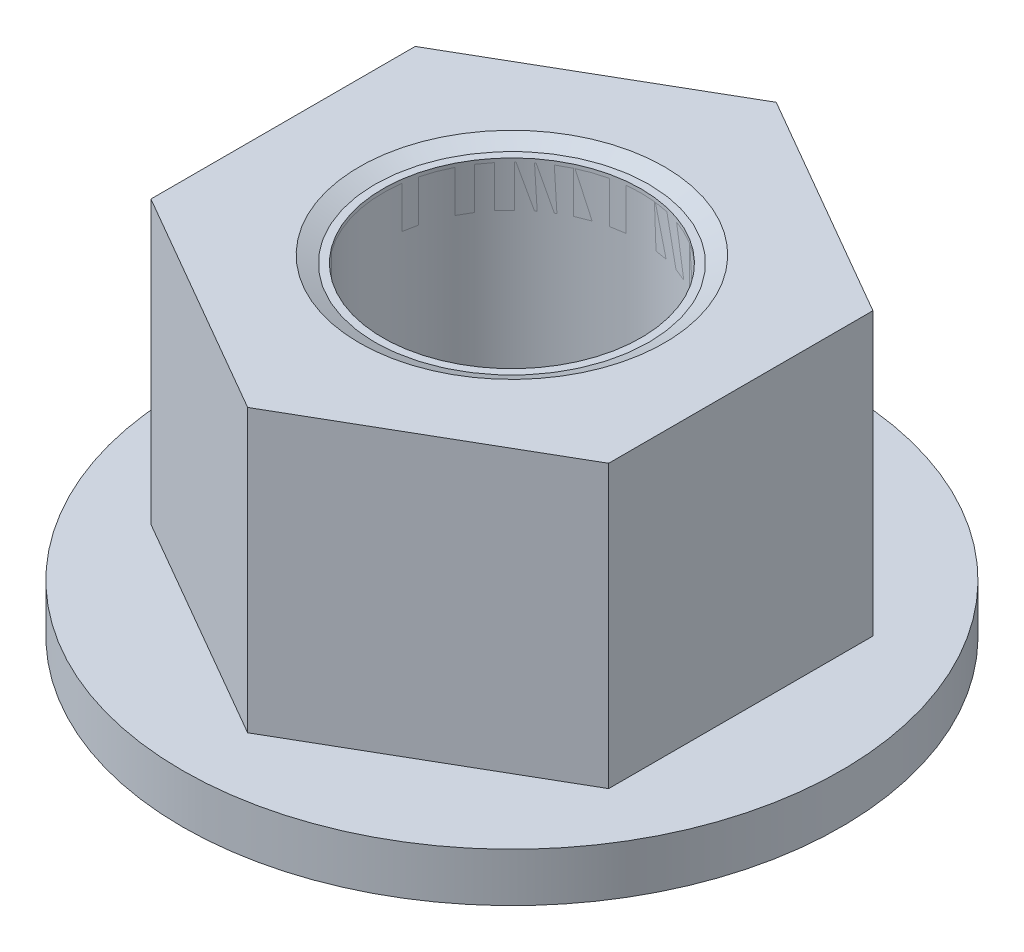
ISO-10303-21;
HEADER;
FILE_DESCRIPTION(('STEP AP214'),'2;1');
FILE_NAME('part.step','',(''),(''),'','','');
FILE_SCHEMA(('AUTOMOTIVE_DESIGN { 1 0 10303 214 1 1 1 1 }'));
ENDSEC;
DATA;
#1=APPLICATION_CONTEXT('core data for automotive mechanical design processes');
#2=APPLICATION_PROTOCOL_DEFINITION('international standard','automotive_design',2000,#1);
#3=PRODUCT_CONTEXT('',#1,'mechanical');
#4=PRODUCT('Part','Part','',(#3));
#5=PRODUCT_RELATED_PRODUCT_CATEGORY('part','',(#4));
#6=PRODUCT_DEFINITION_FORMATION('','',#4);
#7=PRODUCT_DEFINITION_CONTEXT('part definition',#1,'design');
#8=PRODUCT_DEFINITION('design','',#6,#7);
#9=PRODUCT_DEFINITION_SHAPE('','',#8);
#10=(LENGTH_UNIT() NAMED_UNIT(*) SI_UNIT(.MILLI.,.METRE.));
#11=(NAMED_UNIT(*) PLANE_ANGLE_UNIT() SI_UNIT($,.RADIAN.));
#12=(NAMED_UNIT(*) SI_UNIT($,.STERADIAN.) SOLID_ANGLE_UNIT());
#13=UNCERTAINTY_MEASURE_WITH_UNIT(LENGTH_MEASURE(1.E-05),#10,'distance_accuracy_value','');
#14=(GEOMETRIC_REPRESENTATION_CONTEXT(3) GLOBAL_UNCERTAINTY_ASSIGNED_CONTEXT((#13)) GLOBAL_UNIT_ASSIGNED_CONTEXT((#10,
#11,#12)) REPRESENTATION_CONTEXT('',''));
#15=CARTESIAN_POINT('',(0.,0.,0.));
#16=DIRECTION('',(0.,0.,1.));
#17=DIRECTION('',(1.,0.,0.));
#18=AXIS2_PLACEMENT_3D('',#15,#16,#17);
#19=CARTESIAN_POINT('',(0.,8.67515833333333,0.));
#20=DIRECTION('',(0.,-1.,0.));
#21=DIRECTION('',(0.,0.,-1.));
#22=AXIS2_PLACEMENT_3D('',#19,#20,#21);
#23=CYLINDRICAL_SURFACE('',#22,4.0291118051323);
#24=CARTESIAN_POINT('',(0.,8.67515833333333,0.));
#25=DIRECTION('',(0.,-1.,0.));
#26=DIRECTION('',(0.,0.,-1.));
#27=AXIS2_PLACEMENT_3D('',#24,#25,#26);
#28=CIRCLE('',#27,4.0291118051323);
#29=CARTESIAN_POINT('',(0.,8.67515833333333,-4.0291118051323));
#30=VERTEX_POINT('',#29);
#31=EDGE_CURVE('E11',#30,#30,#28,.T.);
#32=ORIENTED_EDGE('',*,*,#31,.T.);
#33=EDGE_LOOP('',(#32));
#34=FACE_BOUND('',#33,.T.);
#35=CARTESIAN_POINT('',(0.,10.09015,0.));
#36=DIRECTION('',(0.,-1.,0.));
#37=DIRECTION('',(0.,0.,-1.));
#38=AXIS2_PLACEMENT_3D('',#35,#36,#37);
#39=CIRCLE('',#38,4.0291118051323);
#40=CARTESIAN_POINT('',(0.,10.09015,-4.0291118051323));
#41=VERTEX_POINT('',#40);
#42=EDGE_CURVE('E61',#41,#41,#39,.T.);
#43=ORIENTED_EDGE('',*,*,#42,.F.);
#44=EDGE_LOOP('',(#43));
#45=FACE_BOUND('',#44,.T.);
#46=ADVANCED_FACE('F47',(#34,#45),#23,.F.);
#47=CARTESIAN_POINT('',(0.,8.67515833333333,-4.0291118051323));
#48=DIRECTION('',(0.,-1.,0.));
#49=DIRECTION('',(0.,0.,-1.));
#50=AXIS2_PLACEMENT_3D('',#47,#48,#49);
#51=PLANE('',#50);
#52=CARTESIAN_POINT('',(0.,8.67515833333333,0.));
#53=DIRECTION('',(0.,-1.,0.));
#54=DIRECTION('',(0.,0.,-1.));
#55=AXIS2_PLACEMENT_3D('',#52,#53,#54);
#56=CIRCLE('',#55,6.91320181468086);
#57=CARTESIAN_POINT('',(0.,8.67515833333333,-6.91320181468086));
#58=VERTEX_POINT('',#57);
#59=EDGE_CURVE('E53',#58,#58,#56,.T.);
#60=ORIENTED_EDGE('',*,*,#59,.T.);
#61=EDGE_LOOP('',(#60));
#62=FACE_BOUND('',#61,.T.);
#63=ORIENTED_EDGE('',*,*,#31,.F.);
#64=EDGE_LOOP('',(#63));
#65=FACE_BOUND('',#64,.T.);
#66=ADVANCED_FACE('F71',(#62,#65),#51,.T.);
#67=CARTESIAN_POINT('',(0.,8.59895833333333,0.));
#68=DIRECTION('',(0.,-1.,0.));
#69=DIRECTION('',(0.,0.,-1.));
#70=AXIS2_PLACEMENT_3D('',#67,#68,#69);
#71=TOROIDAL_SURFACE('',#70,5.42395833333333,1.49119166666667);
#72=CARTESIAN_POINT('',(0.,10.09015,0.));
#73=DIRECTION('',(0.,-1.,0.));
#74=DIRECTION('',(0.,0.,-1.));
#75=AXIS2_PLACEMENT_3D('',#72,#73,#74);
#76=CIRCLE('',#75,5.42395833333333);
#77=CARTESIAN_POINT('',(0.,10.09015,-5.42395833333333));
#78=VERTEX_POINT('',#77);
#79=EDGE_CURVE('E57',#78,#78,#76,.T.);
#80=ORIENTED_EDGE('',*,*,#79,.T.);
#81=EDGE_LOOP('',(#80));
#82=FACE_BOUND('',#81,.T.);
#83=ORIENTED_EDGE('',*,*,#59,.F.);
#84=EDGE_LOOP('',(#83));
#85=FACE_BOUND('',#84,.T.);
#86=ADVANCED_FACE('F75',(#82,#85),#71,.T.);
#87=CARTESIAN_POINT('',(0.,10.09015,-5.42395833333333));
#88=DIRECTION('',(0.,1.,0.));
#89=DIRECTION('',(0.,0.,1.));
#90=AXIS2_PLACEMENT_3D('',#87,#88,#89);
#91=PLANE('',#90);
#92=ORIENTED_EDGE('',*,*,#42,.T.);
#93=EDGE_LOOP('',(#92));
#94=FACE_BOUND('',#93,.T.);
#95=ORIENTED_EDGE('',*,*,#79,.F.);
#96=EDGE_LOOP('',(#95));
#97=FACE_BOUND('',#96,.T.);
#98=ADVANCED_FACE('F67',(#94,#97),#91,.T.);
#99=CLOSED_SHELL('',(#46,#66,#86,#98));
#100=MANIFOLD_SOLID_BREP('B2',#99);
#101=CARTESIAN_POINT('',(7.14375,10.31875,-4.12444598552339));
#102=DIRECTION('',(-0.5,0.,0.866025403784439));
#103=DIRECTION('',(0.866025403784439,0.,0.5));
#104=AXIS2_PLACEMENT_3D('',#101,#102,#103);
#105=PLANE('',#104);
#106=DIRECTION('',(0.866025403784439,0.,0.5));
#107=VECTOR('',#106,1.);
#108=CARTESIAN_POINT('',(7.14375,1.524,-4.12444598552339));
#109=LINE('',#108,#107);
#110=CARTESIAN_POINT('',(0.,1.524,-8.24889197104678));
#111=VERTEX_POINT('',#110);
#112=CARTESIAN_POINT('',(7.14375,1.524,-4.12444598552339));
#113=VERTEX_POINT('',#112);
#114=EDGE_CURVE('E124',#111,#113,#109,.T.);
#115=ORIENTED_EDGE('',*,*,#114,.F.);
#116=DIRECTION('',(0.,-1.,0.));
#117=VECTOR('',#116,1.);
#118=CARTESIAN_POINT('',(0.,10.31875,-8.24889197104678));
#119=LINE('',#118,#117);
#120=CARTESIAN_POINT('',(0.,10.31875,-8.24889197104678));
#121=VERTEX_POINT('',#120);
#122=EDGE_CURVE('E117',#121,#111,#119,.T.);
#123=ORIENTED_EDGE('',*,*,#122,.F.);
#124=DIRECTION('',(-0.866025403784439,0.,-0.5));
#125=VECTOR('',#124,1.);
#126=CARTESIAN_POINT('',(7.14375,10.31875,-4.12444598552339));
#127=LINE('',#126,#125);
#128=CARTESIAN_POINT('',(7.14375,10.31875,-4.12444598552339));
#129=VERTEX_POINT('',#128);
#130=EDGE_CURVE('E190',#129,#121,#127,.T.);
#131=ORIENTED_EDGE('',*,*,#130,.F.);
#132=DIRECTION('',(0.,-1.,0.));
#133=VECTOR('',#132,1.);
#134=CARTESIAN_POINT('',(7.14375,10.31875,-4.12444598552339));
#135=LINE('',#134,#133);
#136=EDGE_CURVE('E174',#129,#113,#135,.T.);
#137=ORIENTED_EDGE('',*,*,#136,.T.);
#138=EDGE_LOOP('',(#115,#123,#131,#137));
#139=FACE_BOUND('',#138,.T.);
#140=ADVANCED_FACE('F109',(#139),#105,.F.);
#141=CARTESIAN_POINT('',(0.,10.31875,-8.24889197104678));
#142=DIRECTION('',(0.5,0.,0.866025403784439));
#143=DIRECTION('',(0.866025403784439,0.,-0.5));
#144=AXIS2_PLACEMENT_3D('',#141,#142,#143);
#145=PLANE('',#144);
#146=DIRECTION('',(0.866025403784439,0.,-0.5));
#147=VECTOR('',#146,1.);
#148=CARTESIAN_POINT('',(0.,1.524,-8.24889197104678));
#149=LINE('',#148,#147);
#150=CARTESIAN_POINT('',(-7.14375,1.524,-4.12444598552339));
#151=VERTEX_POINT('',#150);
#152=EDGE_CURVE('E131',#151,#111,#149,.T.);
#153=ORIENTED_EDGE('',*,*,#152,.F.);
#154=DIRECTION('',(0.,-1.,0.));
#155=VECTOR('',#154,1.);
#156=CARTESIAN_POINT('',(-7.14375,10.31875,-4.12444598552339));
#157=LINE('',#156,#155);
#158=CARTESIAN_POINT('',(-7.14375,10.31875,-4.12444598552339));
#159=VERTEX_POINT('',#158);
#160=EDGE_CURVE('E222',#159,#151,#157,.T.);
#161=ORIENTED_EDGE('',*,*,#160,.F.);
#162=DIRECTION('',(-0.866025403784439,0.,0.5));
#163=VECTOR('',#162,1.);
#164=CARTESIAN_POINT('',(0.,10.31875,-8.24889197104678));
#165=LINE('',#164,#163);
#166=EDGE_CURVE('E195',#121,#159,#165,.T.);
#167=ORIENTED_EDGE('',*,*,#166,.F.);
#168=ORIENTED_EDGE('',*,*,#122,.T.);
#169=EDGE_LOOP('',(#153,#161,#167,#168));
#170=FACE_BOUND('',#169,.T.);
#171=ADVANCED_FACE('F225',(#170),#145,.F.);
#172=CARTESIAN_POINT('',(-7.14375,10.31875,-4.12444598552339));
#173=DIRECTION('',(1.,0.,0.));
#174=DIRECTION('',(0.,0.,-1.));
#175=AXIS2_PLACEMENT_3D('',#172,#173,#174);
#176=PLANE('',#175);
#177=DIRECTION('',(0.,0.,-1.));
#178=VECTOR('',#177,1.);
#179=CARTESIAN_POINT('',(-7.14375,1.524,-4.12444598552339));
#180=LINE('',#179,#178);
#181=CARTESIAN_POINT('',(-7.14375,1.524,4.12444598552339));
#182=VERTEX_POINT('',#181);
#183=EDGE_CURVE('E197',#182,#151,#180,.T.);
#184=ORIENTED_EDGE('',*,*,#183,.F.);
#185=DIRECTION('',(0.,-1.,0.));
#186=VECTOR('',#185,1.);
#187=CARTESIAN_POINT('',(-7.14375,10.31875,4.12444598552339));
#188=LINE('',#187,#186);
#189=CARTESIAN_POINT('',(-7.14375,10.31875,4.12444598552339));
#190=VERTEX_POINT('',#189);
#191=EDGE_CURVE('E218',#190,#182,#188,.T.);
#192=ORIENTED_EDGE('',*,*,#191,.F.);
#193=DIRECTION('',(0.,0.,1.));
#194=VECTOR('',#193,1.);
#195=CARTESIAN_POINT('',(-7.14375,10.31875,-4.12444598552339));
#196=LINE('',#195,#194);
#197=EDGE_CURVE('E203',#159,#190,#196,.T.);
#198=ORIENTED_EDGE('',*,*,#197,.F.);
#199=ORIENTED_EDGE('',*,*,#160,.T.);
#200=EDGE_LOOP('',(#184,#192,#198,#199));
#201=FACE_BOUND('',#200,.T.);
#202=ADVANCED_FACE('F286',(#201),#176,.F.);
#203=CARTESIAN_POINT('',(-7.14375,10.31875,4.12444598552339));
#204=DIRECTION('',(0.5,0.,-0.866025403784438));
#205=DIRECTION('',(-0.866025403784439,0.,-0.5));
#206=AXIS2_PLACEMENT_3D('',#203,#204,#205);
#207=PLANE('',#206);
#208=DIRECTION('',(-0.866025403784439,0.,-0.5));
#209=VECTOR('',#208,1.);
#210=CARTESIAN_POINT('',(-7.14375,1.524,4.12444598552339));
#211=LINE('',#210,#209);
#212=CARTESIAN_POINT('',(0.,1.524,8.24889197104678));
#213=VERTEX_POINT('',#212);
#214=EDGE_CURVE('E184',#213,#182,#211,.T.);
#215=ORIENTED_EDGE('',*,*,#214,.F.);
#216=DIRECTION('',(0.,-1.,0.));
#217=VECTOR('',#216,1.);
#218=CARTESIAN_POINT('',(0.,10.31875,8.24889197104678));
#219=LINE('',#218,#217);
#220=CARTESIAN_POINT('',(0.,10.31875,8.24889197104678));
#221=VERTEX_POINT('',#220);
#222=EDGE_CURVE('E173',#221,#213,#219,.T.);
#223=ORIENTED_EDGE('',*,*,#222,.F.);
#224=DIRECTION('',(0.866025403784439,0.,0.5));
#225=VECTOR('',#224,1.);
#226=CARTESIAN_POINT('',(-7.14375,10.31875,4.12444598552339));
#227=LINE('',#226,#225);
#228=EDGE_CURVE('E206',#190,#221,#227,.T.);
#229=ORIENTED_EDGE('',*,*,#228,.F.);
#230=ORIENTED_EDGE('',*,*,#191,.T.);
#231=EDGE_LOOP('',(#215,#223,#229,#230));
#232=FACE_BOUND('',#231,.T.);
#233=ADVANCED_FACE('F233',(#232),#207,.F.);
#234=CARTESIAN_POINT('',(0.,10.31875,8.24889197104678));
#235=DIRECTION('',(-0.5,0.,-0.866025403784439));
#236=DIRECTION('',(-0.866025403784439,0.,0.5));
#237=AXIS2_PLACEMENT_3D('',#234,#235,#236);
#238=PLANE('',#237);
#239=DIRECTION('',(-0.866025403784439,0.,0.5));
#240=VECTOR('',#239,1.);
#241=CARTESIAN_POINT('',(0.,1.524,8.24889197104678));
#242=LINE('',#241,#240);
#243=CARTESIAN_POINT('',(7.14375,1.524,4.12444598552339));
#244=VERTEX_POINT('',#243);
#245=EDGE_CURVE('E178',#244,#213,#242,.T.);
#246=ORIENTED_EDGE('',*,*,#245,.F.);
#247=DIRECTION('',(0.,-1.,0.));
#248=VECTOR('',#247,1.);
#249=CARTESIAN_POINT('',(7.14375,10.31875,4.12444598552339));
#250=LINE('',#249,#248);
#251=CARTESIAN_POINT('',(7.14375,10.31875,4.12444598552339));
#252=VERTEX_POINT('',#251);
#253=EDGE_CURVE('E165',#252,#244,#250,.T.);
#254=ORIENTED_EDGE('',*,*,#253,.F.);
#255=DIRECTION('',(0.866025403784439,0.,-0.5));
#256=VECTOR('',#255,1.);
#257=CARTESIAN_POINT('',(0.,10.31875,8.24889197104678));
#258=LINE('',#257,#256);
#259=EDGE_CURVE('E209',#221,#252,#258,.T.);
#260=ORIENTED_EDGE('',*,*,#259,.F.);
#261=ORIENTED_EDGE('',*,*,#222,.T.);
#262=EDGE_LOOP('',(#246,#254,#260,#261));
#263=FACE_BOUND('',#262,.T.);
#264=ADVANCED_FACE('F179',(#263),#238,.F.);
#265=CARTESIAN_POINT('',(7.14375,10.31875,4.12444598552339));
#266=DIRECTION('',(-1.,0.,0.));
#267=DIRECTION('',(0.,0.,1.));
#268=AXIS2_PLACEMENT_3D('',#265,#266,#267);
#269=PLANE('',#268);
#270=DIRECTION('',(0.,0.,1.));
#271=VECTOR('',#270,1.);
#272=CARTESIAN_POINT('',(7.14375,1.524,4.12444598552339));
#273=LINE('',#272,#271);
#274=EDGE_CURVE('E45',#113,#244,#273,.T.);
#275=ORIENTED_EDGE('',*,*,#274,.F.);
#276=ORIENTED_EDGE('',*,*,#136,.F.);
#277=DIRECTION('',(0.,0.,-1.));
#278=VECTOR('',#277,1.);
#279=CARTESIAN_POINT('',(7.14375,10.31875,4.12444598552339));
#280=LINE('',#279,#278);
#281=EDGE_CURVE('E169',#252,#129,#280,.T.);
#282=ORIENTED_EDGE('',*,*,#281,.F.);
#283=ORIENTED_EDGE('',*,*,#253,.T.);
#284=EDGE_LOOP('',(#275,#276,#282,#283));
#285=FACE_BOUND('',#284,.T.);
#286=ADVANCED_FACE('F167',(#285),#269,.F.);
#287=CARTESIAN_POINT('',(7.14375,10.31875,-4.12444598552339));
#288=DIRECTION('',(0.,-1.,0.));
#289=DIRECTION('',(0.,0.,-1.));
#290=AXIS2_PLACEMENT_3D('',#287,#288,#289);
#291=PLANE('',#290);
#292=CARTESIAN_POINT('',(0.,10.31875,0.));
#293=DIRECTION('',(0.,-1.,0.));
#294=DIRECTION('',(0.,0.,-1.));
#295=AXIS2_PLACEMENT_3D('',#292,#293,#294);
#296=CIRCLE('',#295,4.7625);
#297=CARTESIAN_POINT('',(0.,10.31875,-4.7625));
#298=VERTEX_POINT('',#297);
#299=EDGE_CURVE('E245',#298,#298,#296,.T.);
#300=ORIENTED_EDGE('',*,*,#299,.T.);
#301=EDGE_LOOP('',(#300));
#302=FACE_BOUND('',#301,.T.);
#303=ORIENTED_EDGE('',*,*,#130,.T.);
#304=ORIENTED_EDGE('',*,*,#166,.T.);
#305=ORIENTED_EDGE('',*,*,#197,.T.);
#306=ORIENTED_EDGE('',*,*,#228,.T.);
#307=ORIENTED_EDGE('',*,*,#259,.T.);
#308=ORIENTED_EDGE('',*,*,#281,.T.);
#309=EDGE_LOOP('',(#303,#304,#305,#306,#307,#308));
#310=FACE_BOUND('',#309,.T.);
#311=ADVANCED_FACE('F228',(#302,#310),#291,.F.);
#312=CARTESIAN_POINT('',(0.,1.524,-10.287));
#313=DIRECTION('',(0.,-1.,0.));
#314=DIRECTION('',(0.,0.,-1.));
#315=AXIS2_PLACEMENT_3D('',#312,#313,#314);
#316=PLANE('',#315);
#317=CARTESIAN_POINT('',(0.,1.524,0.));
#318=DIRECTION('',(0.,1.,0.));
#319=DIRECTION('',(0.,0.,1.));
#320=AXIS2_PLACEMENT_3D('',#317,#318,#319);
#321=CIRCLE('',#320,10.287);
#322=CARTESIAN_POINT('',(0.,1.524,10.287));
#323=VERTEX_POINT('',#322);
#324=EDGE_CURVE('E241',#323,#323,#321,.T.);
#325=ORIENTED_EDGE('',*,*,#324,.T.);
#326=EDGE_LOOP('',(#325));
#327=FACE_BOUND('',#326,.T.);
#328=ORIENTED_EDGE('',*,*,#152,.T.);
#329=ORIENTED_EDGE('',*,*,#114,.T.);
#330=ORIENTED_EDGE('',*,*,#274,.T.);
#331=ORIENTED_EDGE('',*,*,#245,.T.);
#332=ORIENTED_EDGE('',*,*,#214,.T.);
#333=ORIENTED_EDGE('',*,*,#183,.T.);
#334=EDGE_LOOP('',(#328,#329,#330,#331,#332,#333));
#335=FACE_BOUND('',#334,.T.);
#336=ADVANCED_FACE('F187',(#327,#335),#316,.F.);
#337=CARTESIAN_POINT('',(0.,0.,0.));
#338=DIRECTION('',(0.,1.,0.));
#339=DIRECTION('',(0.,0.,1.));
#340=AXIS2_PLACEMENT_3D('',#337,#338,#339);
#341=CYLINDRICAL_SURFACE('',#340,10.287);
#342=ORIENTED_EDGE('',*,*,#324,.F.);
#343=EDGE_LOOP('',(#342));
#344=FACE_BOUND('',#343,.T.);
#345=CARTESIAN_POINT('',(0.,0.,0.));
#346=DIRECTION('',(0.,1.,0.));
#347=DIRECTION('',(0.,0.,1.));
#348=AXIS2_PLACEMENT_3D('',#345,#346,#347);
#349=CIRCLE('',#348,10.287);
#350=CARTESIAN_POINT('',(0.,0.,10.287));
#351=VERTEX_POINT('',#350);
#352=EDGE_CURVE('E185',#351,#351,#349,.T.);
#353=ORIENTED_EDGE('',*,*,#352,.T.);
#354=EDGE_LOOP('',(#353));
#355=FACE_BOUND('',#354,.T.);
#356=ADVANCED_FACE('F268',(#344,#355),#341,.T.);
#357=CARTESIAN_POINT('',(7.14375,0.,-4.12444598552339));
#358=DIRECTION('',(0.,-1.,0.));
#359=DIRECTION('',(0.,0.,-1.));
#360=AXIS2_PLACEMENT_3D('',#357,#358,#359);
#361=PLANE('',#360);
#362=CARTESIAN_POINT('',(0.,0.,0.));
#363=DIRECTION('',(0.,-1.,0.));
#364=DIRECTION('',(0.,0.,-1.));
#365=AXIS2_PLACEMENT_3D('',#362,#363,#364);
#366=CIRCLE('',#365,4.7625);
#367=CARTESIAN_POINT('',(0.,0.,-4.7625));
#368=VERTEX_POINT('',#367);
#369=EDGE_CURVE('E257',#368,#368,#366,.T.);
#370=ORIENTED_EDGE('',*,*,#369,.F.);
#371=EDGE_LOOP('',(#370));
#372=FACE_BOUND('',#371,.T.);
#373=ORIENTED_EDGE('',*,*,#352,.F.);
#374=EDGE_LOOP('',(#373));
#375=FACE_BOUND('',#374,.T.);
#376=ADVANCED_FACE('F264',(#372,#375),#361,.T.);
#377=CARTESIAN_POINT('',(0.,9.97676546833273,0.));
#378=DIRECTION('',(0.,1.,0.));
#379=DIRECTION('',(0.,0.,1.));
#380=AXIS2_PLACEMENT_3D('',#377,#378,#379);
#381=CONICAL_SURFACE('',#380,4.0291118051323,1.13446401379632);
#382=ORIENTED_EDGE('',*,*,#299,.F.);
#383=EDGE_LOOP('',(#382));
#384=FACE_BOUND('',#383,.T.);
#385=CARTESIAN_POINT('',(0.,9.97676546833273,0.));
#386=DIRECTION('',(0.,-1.,0.));
#387=DIRECTION('',(0.,0.,-1.));
#388=AXIS2_PLACEMENT_3D('',#385,#386,#387);
#389=CIRCLE('',#388,4.0291118051323);
#390=CARTESIAN_POINT('',(0.,9.97676546833273,-4.0291118051323));
#391=VERTEX_POINT('',#390);
#392=EDGE_CURVE('E249',#391,#391,#389,.T.);
#393=ORIENTED_EDGE('',*,*,#392,.T.);
#394=EDGE_LOOP('',(#393));
#395=FACE_BOUND('',#394,.T.);
#396=ADVANCED_FACE('F267',(#384,#395),#381,.F.);
#397=CARTESIAN_POINT('',(0.,10.31875,0.));
#398=DIRECTION('',(0.,-1.,0.));
#399=DIRECTION('',(0.,0.,-1.));
#400=AXIS2_PLACEMENT_3D('',#397,#398,#399);
#401=CYLINDRICAL_SURFACE('',#400,4.0291118051323);
#402=ORIENTED_EDGE('',*,*,#392,.F.);
#403=EDGE_LOOP('',(#402));
#404=FACE_BOUND('',#403,.T.);
#405=CARTESIAN_POINT('',(0.,0.341984531667278,0.));
#406=DIRECTION('',(0.,-1.,0.));
#407=DIRECTION('',(0.,0.,-1.));
#408=AXIS2_PLACEMENT_3D('',#405,#406,#407);
#409=CIRCLE('',#408,4.0291118051323);
#410=CARTESIAN_POINT('',(0.,0.341984531667278,-4.0291118051323));
#411=VERTEX_POINT('',#410);
#412=EDGE_CURVE('E253',#411,#411,#409,.T.);
#413=ORIENTED_EDGE('',*,*,#412,.T.);
#414=EDGE_LOOP('',(#413));
#415=FACE_BOUND('',#414,.T.);
#416=ADVANCED_FACE('F306',(#404,#415),#401,.F.);
#417=CARTESIAN_POINT('',(0.,0.,0.));
#418=DIRECTION('',(0.,-1.,0.));
#419=DIRECTION('',(0.,0.,-1.));
#420=AXIS2_PLACEMENT_3D('',#417,#418,#419);
#421=CONICAL_SURFACE('',#420,4.7625,1.13446401379631);
#422=ORIENTED_EDGE('',*,*,#412,.F.);
#423=EDGE_LOOP('',(#422));
#424=FACE_BOUND('',#423,.T.);
#425=ORIENTED_EDGE('',*,*,#369,.T.);
#426=EDGE_LOOP('',(#425));
#427=FACE_BOUND('',#426,.T.);
#428=ADVANCED_FACE('F262',(#424,#427),#421,.F.);
#429=CLOSED_SHELL('',(#140,#171,#202,#233,#264,#286,#311,#336,#356,#376,#396,#416,#428));
#430=MANIFOLD_SOLID_BREP('B6',#429);
#431=ADVANCED_BREP_SHAPE_REPRESENTATION('',(#18,#100,#430),#14);
#432=SHAPE_DEFINITION_REPRESENTATION(#9,#431);
ENDSEC;
END-ISO-10303-21;
